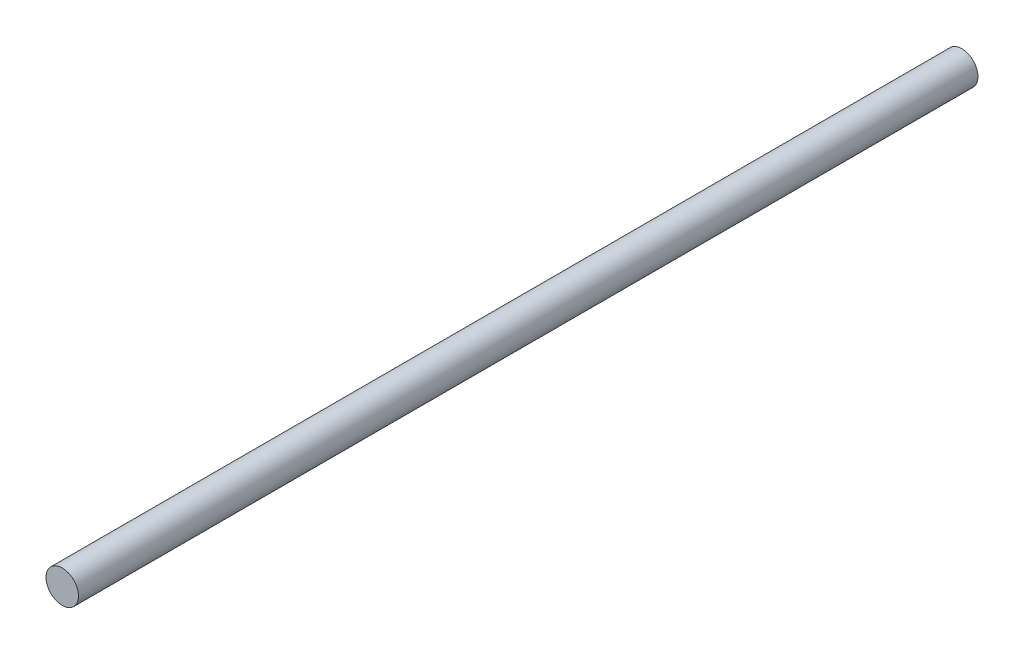
ISO-10303-21;
HEADER;
FILE_DESCRIPTION(('STEP AP214'),'2;1');
FILE_NAME('part.step','',(''),(''),'','','');
FILE_SCHEMA(('AUTOMOTIVE_DESIGN { 1 0 10303 214 1 1 1 1 }'));
ENDSEC;
DATA;
#1=APPLICATION_CONTEXT('core data for automotive mechanical design processes');
#2=APPLICATION_PROTOCOL_DEFINITION('international standard','automotive_design',2000,#1);
#3=PRODUCT_CONTEXT('',#1,'mechanical');
#4=PRODUCT('Part','Part','',(#3));
#5=PRODUCT_RELATED_PRODUCT_CATEGORY('part','',(#4));
#6=PRODUCT_DEFINITION_FORMATION('','',#4);
#7=PRODUCT_DEFINITION_CONTEXT('part definition',#1,'design');
#8=PRODUCT_DEFINITION('design','',#6,#7);
#9=PRODUCT_DEFINITION_SHAPE('','',#8);
#10=(LENGTH_UNIT() NAMED_UNIT(*) SI_UNIT(.MILLI.,.METRE.));
#11=(NAMED_UNIT(*) PLANE_ANGLE_UNIT() SI_UNIT($,.RADIAN.));
#12=(NAMED_UNIT(*) SI_UNIT($,.STERADIAN.) SOLID_ANGLE_UNIT());
#13=UNCERTAINTY_MEASURE_WITH_UNIT(LENGTH_MEASURE(1.E-05),#10,'distance_accuracy_value','');
#14=(GEOMETRIC_REPRESENTATION_CONTEXT(3) GLOBAL_UNCERTAINTY_ASSIGNED_CONTEXT((#13)) GLOBAL_UNIT_ASSIGNED_CONTEXT((#10,
#11,#12)) REPRESENTATION_CONTEXT('',''));
#15=CARTESIAN_POINT('',(0.,0.,0.));
#16=DIRECTION('',(0.,0.,1.));
#17=DIRECTION('',(1.,0.,0.));
#18=AXIS2_PLACEMENT_3D('',#15,#16,#17);
#19=CARTESIAN_POINT('',(0.,2.28599999999998,127.));
#20=DIRECTION('',(0.,0.,1.));
#21=DIRECTION('',(1.,0.,0.));
#22=AXIS2_PLACEMENT_3D('',#19,#20,#21);
#23=PLANE('',#22);
#24=CARTESIAN_POINT('',(0.,0.,127.));
#25=DIRECTION('',(0.,0.,-1.));
#26=DIRECTION('',(-1.,0.,0.));
#27=AXIS2_PLACEMENT_3D('',#24,#25,#26);
#28=CIRCLE('',#27,2.28599999999998);
#29=CARTESIAN_POINT('',(-2.28599999999998,0.,127.));
#30=VERTEX_POINT('',#29);
#31=EDGE_CURVE('E11',#30,#30,#28,.T.);
#32=ORIENTED_EDGE('',*,*,#31,.F.);
#33=EDGE_LOOP('',(#32));
#34=FACE_BOUND('',#33,.T.);
#35=ADVANCED_FACE('F34',(#34),#23,.T.);
#36=CARTESIAN_POINT('',(0.,0.,-3.94218028741472));
#37=DIRECTION('',(0.,0.,-1.));
#38=DIRECTION('',(-1.,0.,0.));
#39=AXIS2_PLACEMENT_3D('',#36,#37,#38);
#40=CYLINDRICAL_SURFACE('',#39,2.28599999999999);
#41=ORIENTED_EDGE('',*,*,#31,.T.);
#42=EDGE_LOOP('',(#41));
#43=FACE_BOUND('',#42,.T.);
#44=CARTESIAN_POINT('',(0.,0.,0.403083477899544));
#45=DIRECTION('',(0.,0.,-1.));
#46=DIRECTION('',(-1.,0.,0.));
#47=AXIS2_PLACEMENT_3D('',#44,#45,#46);
#48=CIRCLE('',#47,2.286);
#49=CARTESIAN_POINT('',(-2.286,0.,0.403083477899544));
#50=VERTEX_POINT('',#49);
#51=EDGE_CURVE('E40',#50,#50,#48,.T.);
#52=ORIENTED_EDGE('',*,*,#51,.F.);
#53=EDGE_LOOP('',(#52));
#54=FACE_BOUND('',#53,.T.);
#55=ADVANCED_FACE('F45',(#43,#54),#40,.T.);
#56=CARTESIAN_POINT('',(0.,0.,0.));
#57=DIRECTION('',(0.,0.,1.));
#58=DIRECTION('',(1.,0.,0.));
#59=AXIS2_PLACEMENT_3D('',#56,#57,#58);
#60=CONICAL_SURFACE('',#59,0.,1.39626340159547);
#61=ORIENTED_EDGE('',*,*,#51,.T.);
#62=EDGE_LOOP('',(#61));
#63=FACE_BOUND('',#62,.T.);
#64=CARTESIAN_POINT('',(0.,0.,0.));
#65=VERTEX_POINT('',#64);
#66=VERTEX_LOOP('',#65);
#67=FACE_BOUND('',#66,.T.);
#68=ADVANCED_FACE('F43',(#63,#67),#60,.T.);
#69=CLOSED_SHELL('',(#35,#55,#68));
#70=MANIFOLD_SOLID_BREP('B2',#69);
#71=ADVANCED_BREP_SHAPE_REPRESENTATION('',(#18,#70),#14);
#72=SHAPE_DEFINITION_REPRESENTATION(#9,#71);
ENDSEC;
END-ISO-10303-21;
